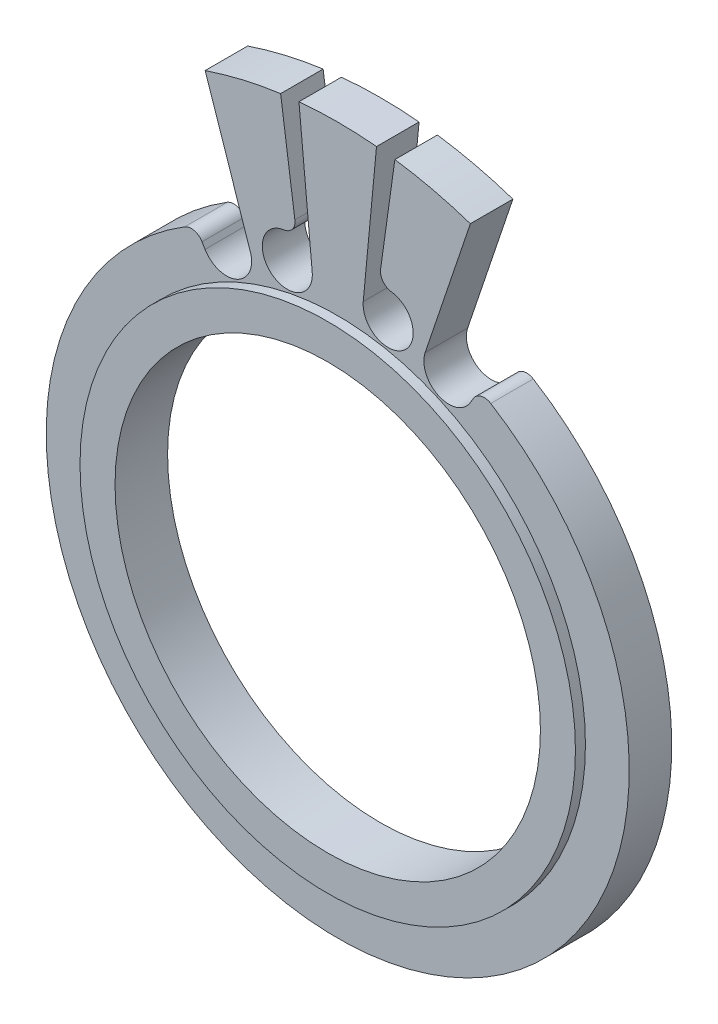
ISO-10303-21;
HEADER;
FILE_DESCRIPTION(('STEP AP214'),'2;1');
FILE_NAME('part.step','',(''),(''),'','','');
FILE_SCHEMA(('AUTOMOTIVE_DESIGN { 1 0 10303 214 1 1 1 1 }'));
ENDSEC;
DATA;
#1=APPLICATION_CONTEXT('core data for automotive mechanical design processes');
#2=APPLICATION_PROTOCOL_DEFINITION('international standard','automotive_design',2000,#1);
#3=PRODUCT_CONTEXT('',#1,'mechanical');
#4=PRODUCT('Part','Part','',(#3));
#5=PRODUCT_RELATED_PRODUCT_CATEGORY('part','',(#4));
#6=PRODUCT_DEFINITION_FORMATION('','',#4);
#7=PRODUCT_DEFINITION_CONTEXT('part definition',#1,'design');
#8=PRODUCT_DEFINITION('design','',#6,#7);
#9=PRODUCT_DEFINITION_SHAPE('','',#8);
#10=(LENGTH_UNIT() NAMED_UNIT(*) SI_UNIT(.MILLI.,.METRE.));
#11=(NAMED_UNIT(*) PLANE_ANGLE_UNIT() SI_UNIT($,.RADIAN.));
#12=(NAMED_UNIT(*) SI_UNIT($,.STERADIAN.) SOLID_ANGLE_UNIT());
#13=UNCERTAINTY_MEASURE_WITH_UNIT(LENGTH_MEASURE(1.E-05),#10,'distance_accuracy_value','');
#14=(GEOMETRIC_REPRESENTATION_CONTEXT(3) GLOBAL_UNCERTAINTY_ASSIGNED_CONTEXT((#13)) GLOBAL_UNIT_ASSIGNED_CONTEXT((#10,
#11,#12)) REPRESENTATION_CONTEXT('',''));
#15=CARTESIAN_POINT('',(0.,0.,0.));
#16=DIRECTION('',(0.,0.,1.));
#17=DIRECTION('',(1.,0.,0.));
#18=AXIS2_PLACEMENT_3D('',#15,#16,#17);
#19=CARTESIAN_POINT('',(8.88372077810101,20.1040384526555,3.4));
#20=DIRECTION('',(0.,0.,1.));
#21=DIRECTION('',(1.,0.,0.));
#22=AXIS2_PLACEMENT_3D('',#19,#20,#21);
#23=PLANE('',#22);
#24=CARTESIAN_POINT('',(8.88372077810101,20.1040384526555,3.4));
#25=DIRECTION('',(0.,0.,-1.));
#26=DIRECTION('',(1.,0.,0.));
#27=AXIS2_PLACEMENT_3D('',#24,#25,#26);
#28=CIRCLE('',#27,2.);
#29=CARTESIAN_POINT('',(10.6048195543626,19.085304433222,3.4));
#30=VERTEX_POINT('',#29);
#31=CARTESIAN_POINT('',(6.9883979791771,20.7425926695229,3.4));
#32=VERTEX_POINT('',#31);
#33=EDGE_CURVE('E240',#30,#32,#28,.T.);
#34=ORIENTED_EDGE('',*,*,#33,.T.);
#35=DIRECTION('',(0.319277108433735,0.947661399461956,0.));
#36=VECTOR('',#35,1.);
#37=CARTESIAN_POINT('',(10.6,31.4623584621369,3.4));
#38=LINE('',#37,#36);
#39=CARTESIAN_POINT('',(10.6,31.4623584621369,3.4));
#40=VERTEX_POINT('',#39);
#41=EDGE_CURVE('E128',#32,#40,#38,.T.);
#42=ORIENTED_EDGE('',*,*,#41,.T.);
#43=CARTESIAN_POINT('',(0.,0.,3.4));
#44=DIRECTION('',(0.,0.,1.));
#45=DIRECTION('',(1.,0.,0.));
#46=AXIS2_PLACEMENT_3D('',#43,#44,#45);
#47=CIRCLE('',#46,33.2);
#48=CARTESIAN_POINT('',(4.56533397453801,32.8846122936082,3.4));
#49=VERTEX_POINT('',#48);
#50=EDGE_CURVE('E291',#40,#49,#47,.T.);
#51=ORIENTED_EDGE('',*,*,#50,.T.);
#52=DIRECTION('',(-0.138181772742732,-0.990406884912295,0.));
#53=VECTOR('',#52,1.);
#54=CARTESIAN_POINT('',(3.42601472318954,24.7186320181236,3.4));
#55=LINE('',#54,#53);
#56=CARTESIAN_POINT('',(3.42601472318954,24.7186320181236,3.4));
#57=VERTEX_POINT('',#56);
#58=EDGE_CURVE('E310',#49,#57,#55,.T.);
#59=ORIENTED_EDGE('',*,*,#58,.T.);
#60=CARTESIAN_POINT('',(4.41642160810184,24.5804502453809,3.4));
#61=DIRECTION('',(0.,0.,1.));
#62=DIRECTION('',(1.,0.,0.));
#63=AXIS2_PLACEMENT_3D('',#60,#61,#62);
#64=CIRCLE('',#63,1.);
#65=CARTESIAN_POINT('',(4.28766962221205,23.5887734199335,3.4));
#66=VERTEX_POINT('',#65);
#67=EDGE_CURVE('E307',#57,#66,#64,.T.);
#68=ORIENTED_EDGE('',*,*,#67,.T.);
#69=CARTESIAN_POINT('',(4.03016565043249,21.6054197690387,3.4));
#70=DIRECTION('',(0.,0.,-1.));
#71=DIRECTION('',(1.,0.,0.));
#72=AXIS2_PLACEMENT_3D('',#69,#70,#71);
#73=CIRCLE('',#72,2.);
#74=CARTESIAN_POINT('',(2.03898301606173,21.7930143227452,3.4));
#75=VERTEX_POINT('',#74);
#76=EDGE_CURVE('E309',#66,#75,#73,.T.);
#77=ORIENTED_EDGE('',*,*,#76,.T.);
#78=DIRECTION('',(0.0937972768532526,0.995591317185377,0.));
#79=VECTOR('',#78,1.);
#80=CARTESIAN_POINT('',(2.03898301606173,21.7930143227452,3.4));
#81=LINE('',#80,#79);
#82=CARTESIAN_POINT('',(3.1,33.0549542428968,3.4));
#83=VERTEX_POINT('',#82);
#84=EDGE_CURVE('E312',#75,#83,#81,.T.);
#85=ORIENTED_EDGE('',*,*,#84,.T.);
#86=CARTESIAN_POINT('',(0.,0.,3.4));
#87=DIRECTION('',(0.,0.,1.));
#88=DIRECTION('',(1.,0.,0.));
#89=AXIS2_PLACEMENT_3D('',#86,#87,#88);
#90=CIRCLE('',#89,33.2);
#91=CARTESIAN_POINT('',(-3.1,33.0549542428968,3.4));
#92=VERTEX_POINT('',#91);
#93=EDGE_CURVE('E318',#83,#92,#90,.T.);
#94=ORIENTED_EDGE('',*,*,#93,.T.);
#95=DIRECTION('',(0.0937972768532526,-0.995591317185377,0.));
#96=VECTOR('',#95,1.);
#97=CARTESIAN_POINT('',(-2.03898301606173,21.7930143227452,3.4));
#98=LINE('',#97,#96);
#99=CARTESIAN_POINT('',(-2.03898301606173,21.7930143227452,3.4));
#100=VERTEX_POINT('',#99);
#101=EDGE_CURVE('E320',#92,#100,#98,.T.);
#102=ORIENTED_EDGE('',*,*,#101,.T.);
#103=CARTESIAN_POINT('',(-4.03016565043249,21.6054197690387,3.4));
#104=DIRECTION('',(0.,0.,-1.));
#105=DIRECTION('',(-1.,0.,0.));
#106=AXIS2_PLACEMENT_3D('',#103,#104,#105);
#107=CIRCLE('',#106,2.);
#108=CARTESIAN_POINT('',(-4.28766962221205,23.5887734199335,3.4));
#109=VERTEX_POINT('',#108);
#110=EDGE_CURVE('E322',#100,#109,#107,.T.);
#111=ORIENTED_EDGE('',*,*,#110,.T.);
#112=CARTESIAN_POINT('',(-4.41642160810184,24.5804502453809,3.4));
#113=DIRECTION('',(0.,0.,1.));
#114=DIRECTION('',(-1.,0.,0.));
#115=AXIS2_PLACEMENT_3D('',#112,#113,#114);
#116=CIRCLE('',#115,1.);
#117=CARTESIAN_POINT('',(-3.42601472318954,24.7186320181236,3.4));
#118=VERTEX_POINT('',#117);
#119=EDGE_CURVE('E324',#109,#118,#116,.T.);
#120=ORIENTED_EDGE('',*,*,#119,.T.);
#121=DIRECTION('',(-0.138181772742732,0.990406884912295,0.));
#122=VECTOR('',#121,1.);
#123=CARTESIAN_POINT('',(-3.42601472318954,24.7186320181236,3.4));
#124=LINE('',#123,#122);
#125=CARTESIAN_POINT('',(-4.56533397453801,32.8846122936082,3.4));
#126=VERTEX_POINT('',#125);
#127=EDGE_CURVE('E326',#118,#126,#124,.T.);
#128=ORIENTED_EDGE('',*,*,#127,.T.);
#129=CARTESIAN_POINT('',(0.,0.,3.4));
#130=DIRECTION('',(0.,0.,1.));
#131=DIRECTION('',(-1.,0.,0.));
#132=AXIS2_PLACEMENT_3D('',#129,#130,#131);
#133=CIRCLE('',#132,33.2);
#134=CARTESIAN_POINT('',(-10.6,31.4623584621369,3.4));
#135=VERTEX_POINT('',#134);
#136=EDGE_CURVE('E328',#126,#135,#133,.T.);
#137=ORIENTED_EDGE('',*,*,#136,.T.);
#138=DIRECTION('',(0.319277108433735,-0.947661399461956,0.));
#139=VECTOR('',#138,1.);
#140=CARTESIAN_POINT('',(-10.6,31.4623584621369,3.4));
#141=LINE('',#140,#139);
#142=CARTESIAN_POINT('',(-6.9883979791771,20.7425926695229,3.4));
#143=VERTEX_POINT('',#142);
#144=EDGE_CURVE('E330',#135,#143,#141,.T.);
#145=ORIENTED_EDGE('',*,*,#144,.T.);
#146=CARTESIAN_POINT('',(-8.88372077810101,20.1040384526555,3.4));
#147=DIRECTION('',(0.,0.,-1.));
#148=DIRECTION('',(-1.,0.,0.));
#149=AXIS2_PLACEMENT_3D('',#146,#147,#148);
#150=CIRCLE('',#149,2.);
#151=CARTESIAN_POINT('',(-10.6048195543626,19.085304433222,3.4));
#152=VERTEX_POINT('',#151);
#153=EDGE_CURVE('E332',#143,#152,#150,.T.);
#154=ORIENTED_EDGE('',*,*,#153,.T.);
#155=DIRECTION('',(-0.509367009716708,0.86054938813078,0.));
#156=VECTOR('',#155,1.);
#157=CARTESIAN_POINT('',(-10.6048195543626,19.085304433222,3.4));
#158=LINE('',#157,#156);
#159=CARTESIAN_POINT('',(-10.8445979420331,19.4903976977262,3.4));
#160=VERTEX_POINT('',#159);
#161=EDGE_CURVE('E334',#152,#160,#158,.T.);
#162=ORIENTED_EDGE('',*,*,#161,.T.);
#163=CARTESIAN_POINT('',(-11.7051473301639,18.9810306880095,3.4));
#164=DIRECTION('',(0.,0.,1.));
#165=DIRECTION('',(1.,0.,0.));
#166=AXIS2_PLACEMENT_3D('',#163,#164,#165);
#167=CIRCLE('',#166,1.);
#168=CARTESIAN_POINT('',(-12.2300418292744,19.8321979834359,3.4));
#169=VERTEX_POINT('',#168);
#170=EDGE_CURVE('E183',#160,#169,#167,.T.);
#171=ORIENTED_EDGE('',*,*,#170,.T.);
#172=CARTESIAN_POINT('',(0.,0.,3.4));
#173=DIRECTION('',(0.,0.,1.));
#174=DIRECTION('',(1.,0.,0.));
#175=AXIS2_PLACEMENT_3D('',#172,#173,#174);
#176=CIRCLE('',#175,23.3);
#177=CARTESIAN_POINT('',(12.2300418292744,19.8321979834359,3.4));
#178=VERTEX_POINT('',#177);
#179=EDGE_CURVE('E177',#169,#178,#176,.T.);
#180=ORIENTED_EDGE('',*,*,#179,.T.);
#181=CARTESIAN_POINT('',(11.7051473301639,18.9810306880095,3.4));
#182=DIRECTION('',(0.,0.,1.));
#183=DIRECTION('',(-1.,0.,0.));
#184=AXIS2_PLACEMENT_3D('',#181,#182,#183);
#185=CIRCLE('',#184,1.);
#186=CARTESIAN_POINT('',(10.8445979420331,19.4903976977262,3.4));
#187=VERTEX_POINT('',#186);
#188=EDGE_CURVE('E181',#178,#187,#185,.T.);
#189=ORIENTED_EDGE('',*,*,#188,.T.);
#190=DIRECTION('',(-0.509367009716708,-0.86054938813078,0.));
#191=VECTOR('',#190,1.);
#192=CARTESIAN_POINT('',(10.6048195543626,19.085304433222,3.4));
#193=LINE('',#192,#191);
#194=EDGE_CURVE('E49',#187,#30,#193,.T.);
#195=ORIENTED_EDGE('',*,*,#194,.T.);
#196=EDGE_LOOP('',(#34,#42,#51,#59,#68,#77,#85,#94,#102,#111,#120,#128,#137,#145,#154,#162,#171,
#180,#189,#195));
#197=FACE_BOUND('',#196,.T.);
#198=CARTESIAN_POINT('',(0.,0.,3.4));
#199=DIRECTION('',(0.,0.,1.));
#200=DIRECTION('',(1.,0.,0.));
#201=AXIS2_PLACEMENT_3D('',#198,#199,#200);
#202=CIRCLE('',#201,19.8);
#203=CARTESIAN_POINT('',(19.8,0.,3.4));
#204=VERTEX_POINT('',#203);
#205=EDGE_CURVE('E383',#204,#204,#202,.T.);
#206=ORIENTED_EDGE('',*,*,#205,.F.);
#207=EDGE_LOOP('',(#206));
#208=FACE_BOUND('',#207,.T.);
#209=ADVANCED_FACE('F32',(#197,#208),#23,.T.);
#210=CARTESIAN_POINT('',(8.88372077810101,20.1040384526555,0.));
#211=DIRECTION('',(0.,0.,1.));
#212=DIRECTION('',(1.,0.,0.));
#213=AXIS2_PLACEMENT_3D('',#210,#211,#212);
#214=PLANE('',#213);
#215=CARTESIAN_POINT('',(8.88372077810101,20.1040384526555,0.));
#216=DIRECTION('',(0.,0.,-1.));
#217=DIRECTION('',(1.,0.,0.));
#218=AXIS2_PLACEMENT_3D('',#215,#216,#217);
#219=CIRCLE('',#218,2.);
#220=CARTESIAN_POINT('',(10.6048195543626,19.085304433222,0.));
#221=VERTEX_POINT('',#220);
#222=CARTESIAN_POINT('',(6.9883979791771,20.7425926695229,0.));
#223=VERTEX_POINT('',#222);
#224=EDGE_CURVE('E201',#221,#223,#219,.T.);
#225=ORIENTED_EDGE('',*,*,#224,.F.);
#226=DIRECTION('',(-0.509367009716708,-0.86054938813078,0.));
#227=VECTOR('',#226,1.);
#228=CARTESIAN_POINT('',(10.6048195543626,19.085304433222,0.));
#229=LINE('',#228,#227);
#230=CARTESIAN_POINT('',(10.8445979420331,19.4903976977262,0.));
#231=VERTEX_POINT('',#230);
#232=EDGE_CURVE('E120',#231,#221,#229,.T.);
#233=ORIENTED_EDGE('',*,*,#232,.F.);
#234=CARTESIAN_POINT('',(11.7051473301639,18.9810306880095,0.));
#235=DIRECTION('',(0.,0.,1.));
#236=DIRECTION('',(-1.,0.,0.));
#237=AXIS2_PLACEMENT_3D('',#234,#235,#236);
#238=CIRCLE('',#237,1.);
#239=CARTESIAN_POINT('',(12.2300418292744,19.8321979834359,0.));
#240=VERTEX_POINT('',#239);
#241=EDGE_CURVE('E114',#240,#231,#238,.T.);
#242=ORIENTED_EDGE('',*,*,#241,.F.);
#243=CARTESIAN_POINT('',(0.,0.,0.));
#244=DIRECTION('',(0.,0.,1.));
#245=DIRECTION('',(1.,0.,0.));
#246=AXIS2_PLACEMENT_3D('',#243,#244,#245);
#247=CIRCLE('',#246,23.3);
#248=CARTESIAN_POINT('',(-12.2300418292744,19.8321979834359,0.));
#249=VERTEX_POINT('',#248);
#250=EDGE_CURVE('E191',#249,#240,#247,.T.);
#251=ORIENTED_EDGE('',*,*,#250,.F.);
#252=CARTESIAN_POINT('',(-11.7051473301639,18.9810306880095,0.));
#253=DIRECTION('',(0.,0.,1.));
#254=DIRECTION('',(1.,0.,0.));
#255=AXIS2_PLACEMENT_3D('',#252,#253,#254);
#256=CIRCLE('',#255,1.);
#257=CARTESIAN_POINT('',(-10.8445979420331,19.4903976977262,0.));
#258=VERTEX_POINT('',#257);
#259=EDGE_CURVE('E235',#258,#249,#256,.T.);
#260=ORIENTED_EDGE('',*,*,#259,.F.);
#261=DIRECTION('',(-0.509367009716708,0.86054938813078,0.));
#262=VECTOR('',#261,1.);
#263=CARTESIAN_POINT('',(-10.6048195543626,19.085304433222,0.));
#264=LINE('',#263,#262);
#265=CARTESIAN_POINT('',(-10.6048195543626,19.085304433222,0.));
#266=VERTEX_POINT('',#265);
#267=EDGE_CURVE('E233',#266,#258,#264,.T.);
#268=ORIENTED_EDGE('',*,*,#267,.F.);
#269=CARTESIAN_POINT('',(-8.88372077810101,20.1040384526555,0.));
#270=DIRECTION('',(0.,0.,-1.));
#271=DIRECTION('',(-1.,0.,0.));
#272=AXIS2_PLACEMENT_3D('',#269,#270,#271);
#273=CIRCLE('',#272,2.);
#274=CARTESIAN_POINT('',(-6.9883979791771,20.7425926695229,0.));
#275=VERTEX_POINT('',#274);
#276=EDGE_CURVE('E231',#275,#266,#273,.T.);
#277=ORIENTED_EDGE('',*,*,#276,.F.);
#278=DIRECTION('',(0.319277108433735,-0.947661399461956,0.));
#279=VECTOR('',#278,1.);
#280=CARTESIAN_POINT('',(-10.6,31.4623584621369,0.));
#281=LINE('',#280,#279);
#282=CARTESIAN_POINT('',(-10.6,31.4623584621369,0.));
#283=VERTEX_POINT('',#282);
#284=EDGE_CURVE('E229',#283,#275,#281,.T.);
#285=ORIENTED_EDGE('',*,*,#284,.F.);
#286=CARTESIAN_POINT('',(0.,0.,0.));
#287=DIRECTION('',(0.,0.,1.));
#288=DIRECTION('',(-1.,0.,0.));
#289=AXIS2_PLACEMENT_3D('',#286,#287,#288);
#290=CIRCLE('',#289,33.2);
#291=CARTESIAN_POINT('',(-4.56533397453801,32.8846122936082,0.));
#292=VERTEX_POINT('',#291);
#293=EDGE_CURVE('E227',#292,#283,#290,.T.);
#294=ORIENTED_EDGE('',*,*,#293,.F.);
#295=DIRECTION('',(-0.138181772742732,0.990406884912295,0.));
#296=VECTOR('',#295,1.);
#297=CARTESIAN_POINT('',(-3.42601472318954,24.7186320181236,0.));
#298=LINE('',#297,#296);
#299=CARTESIAN_POINT('',(-3.42601472318954,24.7186320181236,0.));
#300=VERTEX_POINT('',#299);
#301=EDGE_CURVE('E225',#300,#292,#298,.T.);
#302=ORIENTED_EDGE('',*,*,#301,.F.);
#303=CARTESIAN_POINT('',(-4.41642160810184,24.5804502453809,0.));
#304=DIRECTION('',(0.,0.,1.));
#305=DIRECTION('',(-1.,0.,0.));
#306=AXIS2_PLACEMENT_3D('',#303,#304,#305);
#307=CIRCLE('',#306,1.);
#308=CARTESIAN_POINT('',(-4.28766962221205,23.5887734199335,0.));
#309=VERTEX_POINT('',#308);
#310=EDGE_CURVE('E223',#309,#300,#307,.T.);
#311=ORIENTED_EDGE('',*,*,#310,.F.);
#312=CARTESIAN_POINT('',(-4.03016565043249,21.6054197690387,0.));
#313=DIRECTION('',(0.,0.,-1.));
#314=DIRECTION('',(-1.,0.,0.));
#315=AXIS2_PLACEMENT_3D('',#312,#313,#314);
#316=CIRCLE('',#315,2.);
#317=CARTESIAN_POINT('',(-2.03898301606173,21.7930143227452,0.));
#318=VERTEX_POINT('',#317);
#319=EDGE_CURVE('E221',#318,#309,#316,.T.);
#320=ORIENTED_EDGE('',*,*,#319,.F.);
#321=DIRECTION('',(0.0937972768532526,-0.995591317185377,0.));
#322=VECTOR('',#321,1.);
#323=CARTESIAN_POINT('',(-2.03898301606173,21.7930143227452,0.));
#324=LINE('',#323,#322);
#325=CARTESIAN_POINT('',(-3.1,33.0549542428968,0.));
#326=VERTEX_POINT('',#325);
#327=EDGE_CURVE('E219',#326,#318,#324,.T.);
#328=ORIENTED_EDGE('',*,*,#327,.F.);
#329=CARTESIAN_POINT('',(0.,0.,0.));
#330=DIRECTION('',(0.,0.,1.));
#331=DIRECTION('',(1.,0.,0.));
#332=AXIS2_PLACEMENT_3D('',#329,#330,#331);
#333=CIRCLE('',#332,33.2);
#334=CARTESIAN_POINT('',(3.1,33.0549542428968,0.));
#335=VERTEX_POINT('',#334);
#336=EDGE_CURVE('E217',#335,#326,#333,.T.);
#337=ORIENTED_EDGE('',*,*,#336,.F.);
#338=DIRECTION('',(0.0937972768532526,0.995591317185377,0.));
#339=VECTOR('',#338,1.);
#340=CARTESIAN_POINT('',(2.03898301606173,21.7930143227452,0.));
#341=LINE('',#340,#339);
#342=CARTESIAN_POINT('',(2.03898301606173,21.7930143227452,0.));
#343=VERTEX_POINT('',#342);
#344=EDGE_CURVE('E215',#343,#335,#341,.T.);
#345=ORIENTED_EDGE('',*,*,#344,.F.);
#346=CARTESIAN_POINT('',(4.03016565043249,21.6054197690387,0.));
#347=DIRECTION('',(0.,0.,-1.));
#348=DIRECTION('',(1.,0.,0.));
#349=AXIS2_PLACEMENT_3D('',#346,#347,#348);
#350=CIRCLE('',#349,2.);
#351=CARTESIAN_POINT('',(4.28766962221205,23.5887734199335,0.));
#352=VERTEX_POINT('',#351);
#353=EDGE_CURVE('E213',#352,#343,#350,.T.);
#354=ORIENTED_EDGE('',*,*,#353,.F.);
#355=CARTESIAN_POINT('',(4.41642160810184,24.5804502453809,0.));
#356=DIRECTION('',(0.,0.,1.));
#357=DIRECTION('',(1.,0.,0.));
#358=AXIS2_PLACEMENT_3D('',#355,#356,#357);
#359=CIRCLE('',#358,1.);
#360=CARTESIAN_POINT('',(3.42601472318954,24.7186320181236,0.));
#361=VERTEX_POINT('',#360);
#362=EDGE_CURVE('E211',#361,#352,#359,.T.);
#363=ORIENTED_EDGE('',*,*,#362,.F.);
#364=DIRECTION('',(-0.138181772742732,-0.990406884912295,0.));
#365=VECTOR('',#364,1.);
#366=CARTESIAN_POINT('',(3.42601472318954,24.7186320181236,0.));
#367=LINE('',#366,#365);
#368=CARTESIAN_POINT('',(4.56533397453801,32.8846122936082,0.));
#369=VERTEX_POINT('',#368);
#370=EDGE_CURVE('E209',#369,#361,#367,.T.);
#371=ORIENTED_EDGE('',*,*,#370,.F.);
#372=CARTESIAN_POINT('',(0.,0.,0.));
#373=DIRECTION('',(0.,0.,1.));
#374=DIRECTION('',(1.,0.,0.));
#375=AXIS2_PLACEMENT_3D('',#372,#373,#374);
#376=CIRCLE('',#375,33.2);
#377=CARTESIAN_POINT('',(10.6,31.4623584621369,0.));
#378=VERTEX_POINT('',#377);
#379=EDGE_CURVE('E207',#378,#369,#376,.T.);
#380=ORIENTED_EDGE('',*,*,#379,.F.);
#381=DIRECTION('',(0.319277108433735,0.947661399461956,0.));
#382=VECTOR('',#381,1.);
#383=CARTESIAN_POINT('',(10.6,31.4623584621369,0.));
#384=LINE('',#383,#382);
#385=EDGE_CURVE('E204',#223,#378,#384,.T.);
#386=ORIENTED_EDGE('',*,*,#385,.F.);
#387=EDGE_LOOP('',(#225,#233,#242,#251,#260,#268,#277,#285,#294,#302,#311,#320,#328,#337,#345,
#354,#363,#371,#380,#386));
#388=FACE_BOUND('',#387,.T.);
#389=CARTESIAN_POINT('',(0.,0.,0.));
#390=DIRECTION('',(0.,0.,1.));
#391=DIRECTION('',(1.,0.,0.));
#392=AXIS2_PLACEMENT_3D('',#389,#390,#391);
#393=CIRCLE('',#392,17.);
#394=CARTESIAN_POINT('',(17.,0.,0.));
#395=VERTEX_POINT('',#394);
#396=EDGE_CURVE('E205',#395,#395,#393,.T.);
#397=ORIENTED_EDGE('',*,*,#396,.T.);
#398=EDGE_LOOP('',(#397));
#399=FACE_BOUND('',#398,.T.);
#400=ADVANCED_FACE('F295',(#388,#399),#214,.F.);
#401=CARTESIAN_POINT('',(8.88372077810101,20.1040384526555,3.4));
#402=DIRECTION('',(0.,0.,-1.));
#403=DIRECTION('',(-1.,0.,0.));
#404=AXIS2_PLACEMENT_3D('',#401,#402,#403);
#405=CYLINDRICAL_SURFACE('',#404,2.);
#406=ORIENTED_EDGE('',*,*,#224,.T.);
#407=DIRECTION('',(0.,0.,-1.));
#408=VECTOR('',#407,1.);
#409=CARTESIAN_POINT('',(6.9883979791771,20.7425926695229,3.4));
#410=LINE('',#409,#408);
#411=EDGE_CURVE('E11',#32,#223,#410,.T.);
#412=ORIENTED_EDGE('',*,*,#411,.F.);
#413=ORIENTED_EDGE('',*,*,#33,.F.);
#414=DIRECTION('',(0.,0.,-1.));
#415=VECTOR('',#414,1.);
#416=CARTESIAN_POINT('',(10.6048195543626,19.085304433222,3.4));
#417=LINE('',#416,#415);
#418=EDGE_CURVE('E197',#30,#221,#417,.T.);
#419=ORIENTED_EDGE('',*,*,#418,.T.);
#420=EDGE_LOOP('',(#406,#412,#413,#419));
#421=FACE_BOUND('',#420,.T.);
#422=ADVANCED_FACE('F34',(#421),#405,.F.);
#423=CARTESIAN_POINT('',(10.6,31.4623584621369,3.4));
#424=DIRECTION('',(-0.947661399461956,0.319277108433735,0.));
#425=DIRECTION('',(-0.319277108433735,-0.947661399461956,0.));
#426=AXIS2_PLACEMENT_3D('',#423,#424,#425);
#427=PLANE('',#426);
#428=ORIENTED_EDGE('',*,*,#385,.T.);
#429=DIRECTION('',(0.,0.,-1.));
#430=VECTOR('',#429,1.);
#431=CARTESIAN_POINT('',(10.6,31.4623584621369,3.4));
#432=LINE('',#431,#430);
#433=EDGE_CURVE('E41',#40,#378,#432,.T.);
#434=ORIENTED_EDGE('',*,*,#433,.F.);
#435=ORIENTED_EDGE('',*,*,#41,.F.);
#436=ORIENTED_EDGE('',*,*,#411,.T.);
#437=EDGE_LOOP('',(#428,#434,#435,#436));
#438=FACE_BOUND('',#437,.T.);
#439=ADVANCED_FACE('F573',(#438),#427,.F.);
#440=CARTESIAN_POINT('',(0.,0.,3.4));
#441=DIRECTION('',(0.,0.,-1.));
#442=DIRECTION('',(-1.,0.,0.));
#443=AXIS2_PLACEMENT_3D('',#440,#441,#442);
#444=CYLINDRICAL_SURFACE('',#443,33.2);
#445=ORIENTED_EDGE('',*,*,#379,.T.);
#446=DIRECTION('',(0.,0.,-1.));
#447=VECTOR('',#446,1.);
#448=CARTESIAN_POINT('',(4.56533397453801,32.8846122936082,3.4));
#449=LINE('',#448,#447);
#450=EDGE_CURVE('E283',#49,#369,#449,.T.);
#451=ORIENTED_EDGE('',*,*,#450,.F.);
#452=ORIENTED_EDGE('',*,*,#50,.F.);
#453=ORIENTED_EDGE('',*,*,#433,.T.);
#454=EDGE_LOOP('',(#445,#451,#452,#453));
#455=FACE_BOUND('',#454,.T.);
#456=ADVANCED_FACE('F289',(#455),#444,.T.);
#457=CARTESIAN_POINT('',(3.42601472318954,24.7186320181236,3.4));
#458=DIRECTION('',(0.990406884912295,-0.138181772742732,0.));
#459=DIRECTION('',(0.138181772742732,0.990406884912295,0.));
#460=AXIS2_PLACEMENT_3D('',#457,#458,#459);
#461=PLANE('',#460);
#462=ORIENTED_EDGE('',*,*,#370,.T.);
#463=DIRECTION('',(0.,0.,-1.));
#464=VECTOR('',#463,1.);
#465=CARTESIAN_POINT('',(3.42601472318954,24.7186320181236,3.4));
#466=LINE('',#465,#464);
#467=EDGE_CURVE('E280',#57,#361,#466,.T.);
#468=ORIENTED_EDGE('',*,*,#467,.F.);
#469=ORIENTED_EDGE('',*,*,#58,.F.);
#470=ORIENTED_EDGE('',*,*,#450,.T.);
#471=EDGE_LOOP('',(#462,#468,#469,#470));
#472=FACE_BOUND('',#471,.T.);
#473=ADVANCED_FACE('F301',(#472),#461,.F.);
#474=CARTESIAN_POINT('',(4.41642160810184,24.5804502453809,3.4));
#475=DIRECTION('',(0.,0.,-1.));
#476=DIRECTION('',(-1.,0.,0.));
#477=AXIS2_PLACEMENT_3D('',#474,#475,#476);
#478=CYLINDRICAL_SURFACE('',#477,1.);
#479=ORIENTED_EDGE('',*,*,#362,.T.);
#480=DIRECTION('',(0.,0.,-1.));
#481=VECTOR('',#480,1.);
#482=CARTESIAN_POINT('',(4.28766962221205,23.5887734199335,3.4));
#483=LINE('',#482,#481);
#484=EDGE_CURVE('E277',#66,#352,#483,.T.);
#485=ORIENTED_EDGE('',*,*,#484,.F.);
#486=ORIENTED_EDGE('',*,*,#67,.F.);
#487=ORIENTED_EDGE('',*,*,#467,.T.);
#488=EDGE_LOOP('',(#479,#485,#486,#487));
#489=FACE_BOUND('',#488,.T.);
#490=ADVANCED_FACE('F305',(#489),#478,.T.);
#491=CARTESIAN_POINT('',(4.03016565043249,21.6054197690387,3.4));
#492=DIRECTION('',(0.,0.,-1.));
#493=DIRECTION('',(-1.,0.,0.));
#494=AXIS2_PLACEMENT_3D('',#491,#492,#493);
#495=CYLINDRICAL_SURFACE('',#494,2.);
#496=ORIENTED_EDGE('',*,*,#353,.T.);
#497=DIRECTION('',(0.,0.,-1.));
#498=VECTOR('',#497,1.);
#499=CARTESIAN_POINT('',(2.03898301606173,21.7930143227452,3.4));
#500=LINE('',#499,#498);
#501=EDGE_CURVE('E274',#75,#343,#500,.T.);
#502=ORIENTED_EDGE('',*,*,#501,.F.);
#503=ORIENTED_EDGE('',*,*,#76,.F.);
#504=ORIENTED_EDGE('',*,*,#484,.T.);
#505=EDGE_LOOP('',(#496,#502,#503,#504));
#506=FACE_BOUND('',#505,.T.);
#507=ADVANCED_FACE('F538',(#506),#495,.F.);
#508=CARTESIAN_POINT('',(2.03898301606173,21.7930143227452,3.4));
#509=DIRECTION('',(-0.995591317185377,0.0937972768532526,0.));
#510=DIRECTION('',(-0.0937972768532526,-0.995591317185377,0.));
#511=AXIS2_PLACEMENT_3D('',#508,#509,#510);
#512=PLANE('',#511);
#513=ORIENTED_EDGE('',*,*,#344,.T.);
#514=DIRECTION('',(0.,0.,-1.));
#515=VECTOR('',#514,1.);
#516=CARTESIAN_POINT('',(3.1,33.0549542428968,3.4));
#517=LINE('',#516,#515);
#518=EDGE_CURVE('E271',#83,#335,#517,.T.);
#519=ORIENTED_EDGE('',*,*,#518,.F.);
#520=ORIENTED_EDGE('',*,*,#84,.F.);
#521=ORIENTED_EDGE('',*,*,#501,.T.);
#522=EDGE_LOOP('',(#513,#519,#520,#521));
#523=FACE_BOUND('',#522,.T.);
#524=ADVANCED_FACE('F528',(#523),#512,.F.);
#525=CARTESIAN_POINT('',(0.,0.,3.4));
#526=DIRECTION('',(0.,0.,-1.));
#527=DIRECTION('',(-1.,0.,0.));
#528=AXIS2_PLACEMENT_3D('',#525,#526,#527);
#529=CYLINDRICAL_SURFACE('',#528,33.2);
#530=ORIENTED_EDGE('',*,*,#336,.T.);
#531=DIRECTION('',(0.,0.,-1.));
#532=VECTOR('',#531,1.);
#533=CARTESIAN_POINT('',(-3.1,33.0549542428968,3.4));
#534=LINE('',#533,#532);
#535=EDGE_CURVE('E268',#92,#326,#534,.T.);
#536=ORIENTED_EDGE('',*,*,#535,.F.);
#537=ORIENTED_EDGE('',*,*,#93,.F.);
#538=ORIENTED_EDGE('',*,*,#518,.T.);
#539=EDGE_LOOP('',(#530,#536,#537,#538));
#540=FACE_BOUND('',#539,.T.);
#541=ADVANCED_FACE('F518',(#540),#529,.T.);
#542=CARTESIAN_POINT('',(-2.03898301606173,21.7930143227452,3.4));
#543=DIRECTION('',(0.995591317185377,0.0937972768532526,0.));
#544=DIRECTION('',(-0.0937972768532526,0.995591317185377,0.));
#545=AXIS2_PLACEMENT_3D('',#542,#543,#544);
#546=PLANE('',#545);
#547=ORIENTED_EDGE('',*,*,#327,.T.);
#548=DIRECTION('',(0.,0.,-1.));
#549=VECTOR('',#548,1.);
#550=CARTESIAN_POINT('',(-2.03898301606173,21.7930143227452,3.4));
#551=LINE('',#550,#549);
#552=EDGE_CURVE('E265',#100,#318,#551,.T.);
#553=ORIENTED_EDGE('',*,*,#552,.F.);
#554=ORIENTED_EDGE('',*,*,#101,.F.);
#555=ORIENTED_EDGE('',*,*,#535,.T.);
#556=EDGE_LOOP('',(#547,#553,#554,#555));
#557=FACE_BOUND('',#556,.T.);
#558=ADVANCED_FACE('F508',(#557),#546,.F.);
#559=CARTESIAN_POINT('',(-4.03016565043249,21.6054197690387,3.4));
#560=DIRECTION('',(0.,0.,-1.));
#561=DIRECTION('',(-1.,0.,0.));
#562=AXIS2_PLACEMENT_3D('',#559,#560,#561);
#563=CYLINDRICAL_SURFACE('',#562,2.);
#564=ORIENTED_EDGE('',*,*,#319,.T.);
#565=DIRECTION('',(0.,0.,-1.));
#566=VECTOR('',#565,1.);
#567=CARTESIAN_POINT('',(-4.28766962221205,23.5887734199335,3.4));
#568=LINE('',#567,#566);
#569=EDGE_CURVE('E262',#109,#309,#568,.T.);
#570=ORIENTED_EDGE('',*,*,#569,.F.);
#571=ORIENTED_EDGE('',*,*,#110,.F.);
#572=ORIENTED_EDGE('',*,*,#552,.T.);
#573=EDGE_LOOP('',(#564,#570,#571,#572));
#574=FACE_BOUND('',#573,.T.);
#575=ADVANCED_FACE('F498',(#574),#563,.F.);
#576=CARTESIAN_POINT('',(-4.41642160810184,24.5804502453809,3.4));
#577=DIRECTION('',(0.,0.,-1.));
#578=DIRECTION('',(-1.,0.,0.));
#579=AXIS2_PLACEMENT_3D('',#576,#577,#578);
#580=CYLINDRICAL_SURFACE('',#579,1.);
#581=ORIENTED_EDGE('',*,*,#310,.T.);
#582=DIRECTION('',(0.,0.,-1.));
#583=VECTOR('',#582,1.);
#584=CARTESIAN_POINT('',(-3.42601472318954,24.7186320181236,3.4));
#585=LINE('',#584,#583);
#586=EDGE_CURVE('E259',#118,#300,#585,.T.);
#587=ORIENTED_EDGE('',*,*,#586,.F.);
#588=ORIENTED_EDGE('',*,*,#119,.F.);
#589=ORIENTED_EDGE('',*,*,#569,.T.);
#590=EDGE_LOOP('',(#581,#587,#588,#589));
#591=FACE_BOUND('',#590,.T.);
#592=ADVANCED_FACE('F488',(#591),#580,.T.);
#593=CARTESIAN_POINT('',(-3.42601472318954,24.7186320181236,3.4));
#594=DIRECTION('',(-0.990406884912295,-0.138181772742732,0.));
#595=DIRECTION('',(0.138181772742732,-0.990406884912295,0.));
#596=AXIS2_PLACEMENT_3D('',#593,#594,#595);
#597=PLANE('',#596);
#598=ORIENTED_EDGE('',*,*,#301,.T.);
#599=DIRECTION('',(0.,0.,-1.));
#600=VECTOR('',#599,1.);
#601=CARTESIAN_POINT('',(-4.56533397453801,32.8846122936082,3.4));
#602=LINE('',#601,#600);
#603=EDGE_CURVE('E256',#126,#292,#602,.T.);
#604=ORIENTED_EDGE('',*,*,#603,.F.);
#605=ORIENTED_EDGE('',*,*,#127,.F.);
#606=ORIENTED_EDGE('',*,*,#586,.T.);
#607=EDGE_LOOP('',(#598,#604,#605,#606));
#608=FACE_BOUND('',#607,.T.);
#609=ADVANCED_FACE('F478',(#608),#597,.F.);
#610=CARTESIAN_POINT('',(0.,0.,3.4));
#611=DIRECTION('',(0.,0.,-1.));
#612=DIRECTION('',(-1.,0.,0.));
#613=AXIS2_PLACEMENT_3D('',#610,#611,#612);
#614=CYLINDRICAL_SURFACE('',#613,33.2);
#615=ORIENTED_EDGE('',*,*,#293,.T.);
#616=DIRECTION('',(0.,0.,-1.));
#617=VECTOR('',#616,1.);
#618=CARTESIAN_POINT('',(-10.6,31.4623584621369,3.4));
#619=LINE('',#618,#617);
#620=EDGE_CURVE('E253',#135,#283,#619,.T.);
#621=ORIENTED_EDGE('',*,*,#620,.F.);
#622=ORIENTED_EDGE('',*,*,#136,.F.);
#623=ORIENTED_EDGE('',*,*,#603,.T.);
#624=EDGE_LOOP('',(#615,#621,#622,#623));
#625=FACE_BOUND('',#624,.T.);
#626=ADVANCED_FACE('F468',(#625),#614,.T.);
#627=CARTESIAN_POINT('',(-10.6,31.4623584621369,3.4));
#628=DIRECTION('',(0.947661399461956,0.319277108433735,0.));
#629=DIRECTION('',(-0.319277108433735,0.947661399461956,0.));
#630=AXIS2_PLACEMENT_3D('',#627,#628,#629);
#631=PLANE('',#630);
#632=ORIENTED_EDGE('',*,*,#284,.T.);
#633=DIRECTION('',(0.,0.,-1.));
#634=VECTOR('',#633,1.);
#635=CARTESIAN_POINT('',(-6.9883979791771,20.7425926695229,3.4));
#636=LINE('',#635,#634);
#637=EDGE_CURVE('E250',#143,#275,#636,.T.);
#638=ORIENTED_EDGE('',*,*,#637,.F.);
#639=ORIENTED_EDGE('',*,*,#144,.F.);
#640=ORIENTED_EDGE('',*,*,#620,.T.);
#641=EDGE_LOOP('',(#632,#638,#639,#640));
#642=FACE_BOUND('',#641,.T.);
#643=ADVANCED_FACE('F458',(#642),#631,.F.);
#644=CARTESIAN_POINT('',(-8.88372077810101,20.1040384526555,3.4));
#645=DIRECTION('',(0.,0.,-1.));
#646=DIRECTION('',(-1.,0.,0.));
#647=AXIS2_PLACEMENT_3D('',#644,#645,#646);
#648=CYLINDRICAL_SURFACE('',#647,2.);
#649=ORIENTED_EDGE('',*,*,#276,.T.);
#650=DIRECTION('',(0.,0.,-1.));
#651=VECTOR('',#650,1.);
#652=CARTESIAN_POINT('',(-10.6048195543626,19.085304433222,3.4));
#653=LINE('',#652,#651);
#654=EDGE_CURVE('E247',#152,#266,#653,.T.);
#655=ORIENTED_EDGE('',*,*,#654,.F.);
#656=ORIENTED_EDGE('',*,*,#153,.F.);
#657=ORIENTED_EDGE('',*,*,#637,.T.);
#658=EDGE_LOOP('',(#649,#655,#656,#657));
#659=FACE_BOUND('',#658,.T.);
#660=ADVANCED_FACE('F449',(#659),#648,.F.);
#661=CARTESIAN_POINT('',(-10.6048195543626,19.085304433222,3.4));
#662=DIRECTION('',(-0.86054938813078,-0.509367009716708,0.));
#663=DIRECTION('',(0.509367009716708,-0.86054938813078,0.));
#664=AXIS2_PLACEMENT_3D('',#661,#662,#663);
#665=PLANE('',#664);
#666=ORIENTED_EDGE('',*,*,#267,.T.);
#667=DIRECTION('',(0.,0.,-1.));
#668=VECTOR('',#667,1.);
#669=CARTESIAN_POINT('',(-10.8445979420331,19.4903976977262,3.4));
#670=LINE('',#669,#668);
#671=EDGE_CURVE('E244',#160,#258,#670,.T.);
#672=ORIENTED_EDGE('',*,*,#671,.F.);
#673=ORIENTED_EDGE('',*,*,#161,.F.);
#674=ORIENTED_EDGE('',*,*,#654,.T.);
#675=EDGE_LOOP('',(#666,#672,#673,#674));
#676=FACE_BOUND('',#675,.T.);
#677=ADVANCED_FACE('F340',(#676),#665,.F.);
#678=CARTESIAN_POINT('',(-11.7051473301639,18.9810306880095,3.4));
#679=DIRECTION('',(0.,0.,-1.));
#680=DIRECTION('',(-1.,0.,0.));
#681=AXIS2_PLACEMENT_3D('',#678,#679,#680);
#682=CYLINDRICAL_SURFACE('',#681,1.);
#683=ORIENTED_EDGE('',*,*,#259,.T.);
#684=DIRECTION('',(0.,0.,-1.));
#685=VECTOR('',#684,1.);
#686=CARTESIAN_POINT('',(-12.2300418292744,19.8321979834359,3.4));
#687=LINE('',#686,#685);
#688=EDGE_CURVE('E192',#169,#249,#687,.T.);
#689=ORIENTED_EDGE('',*,*,#688,.F.);
#690=ORIENTED_EDGE('',*,*,#170,.F.);
#691=ORIENTED_EDGE('',*,*,#671,.T.);
#692=EDGE_LOOP('',(#683,#689,#690,#691));
#693=FACE_BOUND('',#692,.T.);
#694=ADVANCED_FACE('F344',(#693),#682,.T.);
#695=CARTESIAN_POINT('',(0.,0.,3.4));
#696=DIRECTION('',(0.,0.,-1.));
#697=DIRECTION('',(-1.,0.,0.));
#698=AXIS2_PLACEMENT_3D('',#695,#696,#697);
#699=CYLINDRICAL_SURFACE('',#698,23.3);
#700=ORIENTED_EDGE('',*,*,#250,.T.);
#701=DIRECTION('',(0.,0.,-1.));
#702=VECTOR('',#701,1.);
#703=CARTESIAN_POINT('',(12.2300418292744,19.8321979834359,3.4));
#704=LINE('',#703,#702);
#705=EDGE_CURVE('E188',#178,#240,#704,.T.);
#706=ORIENTED_EDGE('',*,*,#705,.F.);
#707=ORIENTED_EDGE('',*,*,#179,.F.);
#708=ORIENTED_EDGE('',*,*,#688,.T.);
#709=EDGE_LOOP('',(#700,#706,#707,#708));
#710=FACE_BOUND('',#709,.T.);
#711=ADVANCED_FACE('F189',(#710),#699,.T.);
#712=CARTESIAN_POINT('',(11.7051473301639,18.9810306880095,3.4));
#713=DIRECTION('',(0.,0.,-1.));
#714=DIRECTION('',(-1.,0.,0.));
#715=AXIS2_PLACEMENT_3D('',#712,#713,#714);
#716=CYLINDRICAL_SURFACE('',#715,1.);
#717=ORIENTED_EDGE('',*,*,#241,.T.);
#718=DIRECTION('',(0.,0.,-1.));
#719=VECTOR('',#718,1.);
#720=CARTESIAN_POINT('',(10.8445979420331,19.4903976977262,3.4));
#721=LINE('',#720,#719);
#722=EDGE_CURVE('E193',#187,#231,#721,.T.);
#723=ORIENTED_EDGE('',*,*,#722,.F.);
#724=ORIENTED_EDGE('',*,*,#188,.F.);
#725=ORIENTED_EDGE('',*,*,#705,.T.);
#726=EDGE_LOOP('',(#717,#723,#724,#725));
#727=FACE_BOUND('',#726,.T.);
#728=ADVANCED_FACE('F195',(#727),#716,.T.);
#729=CARTESIAN_POINT('',(10.6048195543626,19.085304433222,3.4));
#730=DIRECTION('',(0.86054938813078,-0.509367009716708,0.));
#731=DIRECTION('',(0.509367009716708,0.86054938813078,0.));
#732=AXIS2_PLACEMENT_3D('',#729,#730,#731);
#733=PLANE('',#732);
#734=ORIENTED_EDGE('',*,*,#232,.T.);
#735=ORIENTED_EDGE('',*,*,#418,.F.);
#736=ORIENTED_EDGE('',*,*,#194,.F.);
#737=ORIENTED_EDGE('',*,*,#722,.T.);
#738=EDGE_LOOP('',(#734,#735,#736,#737));
#739=FACE_BOUND('',#738,.T.);
#740=ADVANCED_FACE('F348',(#739),#733,.F.);
#741=CARTESIAN_POINT('',(0.,0.,3.4));
#742=DIRECTION('',(0.,0.,-1.));
#743=DIRECTION('',(-1.,0.,0.));
#744=AXIS2_PLACEMENT_3D('',#741,#742,#743);
#745=CYLINDRICAL_SURFACE('',#744,17.);
#746=ORIENTED_EDGE('',*,*,#396,.F.);
#747=EDGE_LOOP('',(#746));
#748=FACE_BOUND('',#747,.T.);
#749=CARTESIAN_POINT('',(0.,0.,4.2));
#750=DIRECTION('',(0.,0.,1.));
#751=DIRECTION('',(1.,0.,0.));
#752=AXIS2_PLACEMENT_3D('',#749,#750,#751);
#753=CIRCLE('',#752,17.);
#754=CARTESIAN_POINT('',(17.,0.,4.2));
#755=VERTEX_POINT('',#754);
#756=EDGE_CURVE('E381',#755,#755,#753,.T.);
#757=ORIENTED_EDGE('',*,*,#756,.T.);
#758=EDGE_LOOP('',(#757));
#759=FACE_BOUND('',#758,.T.);
#760=ADVANCED_FACE('F350',(#748,#759),#745,.F.);
#761=CARTESIAN_POINT('',(0.,0.,4.2));
#762=DIRECTION('',(0.,0.,1.));
#763=DIRECTION('',(1.,0.,0.));
#764=AXIS2_PLACEMENT_3D('',#761,#762,#763);
#765=PLANE('',#764);
#766=CARTESIAN_POINT('',(0.,0.,4.2));
#767=DIRECTION('',(0.,0.,1.));
#768=DIRECTION('',(1.,0.,0.));
#769=AXIS2_PLACEMENT_3D('',#766,#767,#768);
#770=CIRCLE('',#769,19.8);
#771=CARTESIAN_POINT('',(19.8,0.,4.2));
#772=VERTEX_POINT('',#771);
#773=EDGE_CURVE('E378',#772,#772,#770,.T.);
#774=ORIENTED_EDGE('',*,*,#773,.T.);
#775=EDGE_LOOP('',(#774));
#776=FACE_BOUND('',#775,.T.);
#777=ORIENTED_EDGE('',*,*,#756,.F.);
#778=EDGE_LOOP('',(#777));
#779=FACE_BOUND('',#778,.T.);
#780=ADVANCED_FACE('F356',(#776,#779),#765,.T.);
#781=CARTESIAN_POINT('',(0.,0.,4.2));
#782=DIRECTION('',(0.,0.,-1.));
#783=DIRECTION('',(-1.,0.,0.));
#784=AXIS2_PLACEMENT_3D('',#781,#782,#783);
#785=CYLINDRICAL_SURFACE('',#784,19.8);
#786=ORIENTED_EDGE('',*,*,#773,.F.);
#787=EDGE_LOOP('',(#786));
#788=FACE_BOUND('',#787,.T.);
#789=ORIENTED_EDGE('',*,*,#205,.T.);
#790=EDGE_LOOP('',(#789));
#791=FACE_BOUND('',#790,.T.);
#792=ADVANCED_FACE('F367',(#788,#791),#785,.T.);
#793=CLOSED_SHELL('',(#209,#400,#422,#439,#456,#473,#490,#507,#524,#541,#558,#575,#592,#609,
#626,#643,#660,#677,#694,#711,#728,#740,#760,#780,#792));
#794=MANIFOLD_SOLID_BREP('B2',#793);
#795=ADVANCED_BREP_SHAPE_REPRESENTATION('',(#18,#794),#14);
#796=SHAPE_DEFINITION_REPRESENTATION(#9,#795);
ENDSEC;
END-ISO-10303-21;
